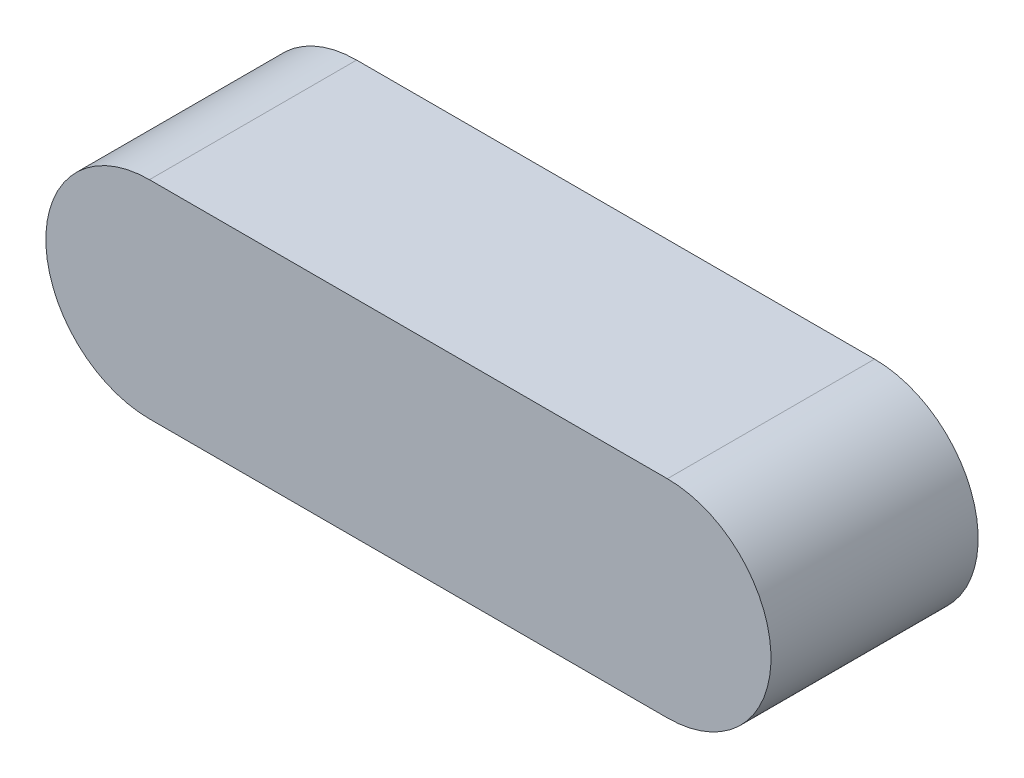
ISO-10303-21;
HEADER;
FILE_DESCRIPTION(('STEP AP214'),'2;1');
FILE_NAME('part.step','',(''),(''),'','','');
FILE_SCHEMA(('AUTOMOTIVE_DESIGN { 1 0 10303 214 1 1 1 1 }'));
ENDSEC;
DATA;
#1=APPLICATION_CONTEXT('core data for automotive mechanical design processes');
#2=APPLICATION_PROTOCOL_DEFINITION('international standard','automotive_design',2000,#1);
#3=PRODUCT_CONTEXT('',#1,'mechanical');
#4=PRODUCT('Part','Part','',(#3));
#5=PRODUCT_RELATED_PRODUCT_CATEGORY('part','',(#4));
#6=PRODUCT_DEFINITION_FORMATION('','',#4);
#7=PRODUCT_DEFINITION_CONTEXT('part definition',#1,'design');
#8=PRODUCT_DEFINITION('design','',#6,#7);
#9=PRODUCT_DEFINITION_SHAPE('','',#8);
#10=(LENGTH_UNIT() NAMED_UNIT(*) SI_UNIT(.MILLI.,.METRE.));
#11=(NAMED_UNIT(*) PLANE_ANGLE_UNIT() SI_UNIT($,.RADIAN.));
#12=(NAMED_UNIT(*) SI_UNIT($,.STERADIAN.) SOLID_ANGLE_UNIT());
#13=UNCERTAINTY_MEASURE_WITH_UNIT(LENGTH_MEASURE(1.E-05),#10,'distance_accuracy_value','');
#14=(GEOMETRIC_REPRESENTATION_CONTEXT(3) GLOBAL_UNCERTAINTY_ASSIGNED_CONTEXT((#13)) GLOBAL_UNIT_ASSIGNED_CONTEXT((#10,
#11,#12)) REPRESENTATION_CONTEXT('',''));
#15=CARTESIAN_POINT('',(0.,0.,0.));
#16=DIRECTION('',(0.,0.,1.));
#17=DIRECTION('',(1.,0.,0.));
#18=AXIS2_PLACEMENT_3D('',#15,#16,#17);
#19=CARTESIAN_POINT('',(0.,0.,4.));
#20=DIRECTION('',(0.,0.,-1.));
#21=DIRECTION('',(-1.,0.,0.));
#22=AXIS2_PLACEMENT_3D('',#19,#20,#21);
#23=CYLINDRICAL_SURFACE('',#22,2.);
#24=CARTESIAN_POINT('',(0.,0.,0.));
#25=DIRECTION('',(0.,0.,1.));
#26=DIRECTION('',(1.,0.,0.));
#27=AXIS2_PLACEMENT_3D('',#24,#25,#26);
#28=CIRCLE('',#27,2.);
#29=CARTESIAN_POINT('',(0.,2.,0.));
#30=VERTEX_POINT('',#29);
#31=CARTESIAN_POINT('',(0.,-2.,0.));
#32=VERTEX_POINT('',#31);
#33=EDGE_CURVE('E96',#30,#32,#28,.T.);
#34=ORIENTED_EDGE('',*,*,#33,.T.);
#35=DIRECTION('',(0.,0.,-1.));
#36=VECTOR('',#35,1.);
#37=CARTESIAN_POINT('',(0.,-2.,4.));
#38=LINE('',#37,#36);
#39=CARTESIAN_POINT('',(0.,-2.,4.));
#40=VERTEX_POINT('',#39);
#41=EDGE_CURVE('E11',#40,#32,#38,.T.);
#42=ORIENTED_EDGE('',*,*,#41,.F.);
#43=CARTESIAN_POINT('',(0.,0.,4.));
#44=DIRECTION('',(0.,0.,1.));
#45=DIRECTION('',(1.,0.,0.));
#46=AXIS2_PLACEMENT_3D('',#43,#44,#45);
#47=CIRCLE('',#46,2.);
#48=CARTESIAN_POINT('',(0.,2.,4.));
#49=VERTEX_POINT('',#48);
#50=EDGE_CURVE('E84',#49,#40,#47,.T.);
#51=ORIENTED_EDGE('',*,*,#50,.F.);
#52=DIRECTION('',(0.,0.,-1.));
#53=VECTOR('',#52,1.);
#54=CARTESIAN_POINT('',(0.,2.,4.));
#55=LINE('',#54,#53);
#56=EDGE_CURVE('E92',#49,#30,#55,.T.);
#57=ORIENTED_EDGE('',*,*,#56,.T.);
#58=EDGE_LOOP('',(#34,#42,#51,#57));
#59=FACE_BOUND('',#58,.T.);
#60=ADVANCED_FACE('F33',(#59),#23,.T.);
#61=CARTESIAN_POINT('',(0.,-2.,4.));
#62=DIRECTION('',(0.,1.,0.));
#63=DIRECTION('',(0.,0.,1.));
#64=AXIS2_PLACEMENT_3D('',#61,#62,#63);
#65=PLANE('',#64);
#66=DIRECTION('',(1.,0.,0.));
#67=VECTOR('',#66,1.);
#68=CARTESIAN_POINT('',(0.,-2.,0.));
#69=LINE('',#68,#67);
#70=CARTESIAN_POINT('',(10.,-2.,0.));
#71=VERTEX_POINT('',#70);
#72=EDGE_CURVE('E88',#32,#71,#69,.T.);
#73=ORIENTED_EDGE('',*,*,#72,.T.);
#74=DIRECTION('',(0.,0.,-1.));
#75=VECTOR('',#74,1.);
#76=CARTESIAN_POINT('',(10.,-2.,4.));
#77=LINE('',#76,#75);
#78=CARTESIAN_POINT('',(10.,-2.,4.));
#79=VERTEX_POINT('',#78);
#80=EDGE_CURVE('E41',#79,#71,#77,.T.);
#81=ORIENTED_EDGE('',*,*,#80,.F.);
#82=DIRECTION('',(1.,0.,0.));
#83=VECTOR('',#82,1.);
#84=CARTESIAN_POINT('',(0.,-2.,4.));
#85=LINE('',#84,#83);
#86=EDGE_CURVE('E79',#40,#79,#85,.T.);
#87=ORIENTED_EDGE('',*,*,#86,.F.);
#88=ORIENTED_EDGE('',*,*,#41,.T.);
#89=EDGE_LOOP('',(#73,#81,#87,#88));
#90=FACE_BOUND('',#89,.T.);
#91=ADVANCED_FACE('F87',(#90),#65,.F.);
#92=CARTESIAN_POINT('',(10.,0.,4.));
#93=DIRECTION('',(0.,0.,-1.));
#94=DIRECTION('',(-1.,0.,0.));
#95=AXIS2_PLACEMENT_3D('',#92,#93,#94);
#96=CYLINDRICAL_SURFACE('',#95,2.);
#97=CARTESIAN_POINT('',(10.,0.,0.));
#98=DIRECTION('',(0.,0.,1.));
#99=DIRECTION('',(1.,0.,0.));
#100=AXIS2_PLACEMENT_3D('',#97,#98,#99);
#101=CIRCLE('',#100,2.);
#102=CARTESIAN_POINT('',(10.,2.,0.));
#103=VERTEX_POINT('',#102);
#104=EDGE_CURVE('E66',#71,#103,#101,.T.);
#105=ORIENTED_EDGE('',*,*,#104,.T.);
#106=DIRECTION('',(0.,0.,-1.));
#107=VECTOR('',#106,1.);
#108=CARTESIAN_POINT('',(10.,2.,4.));
#109=LINE('',#108,#107);
#110=CARTESIAN_POINT('',(10.,2.,4.));
#111=VERTEX_POINT('',#110);
#112=EDGE_CURVE('E89',#111,#103,#109,.T.);
#113=ORIENTED_EDGE('',*,*,#112,.F.);
#114=CARTESIAN_POINT('',(10.,0.,4.));
#115=DIRECTION('',(0.,0.,1.));
#116=DIRECTION('',(1.,0.,0.));
#117=AXIS2_PLACEMENT_3D('',#114,#115,#116);
#118=CIRCLE('',#117,2.);
#119=EDGE_CURVE('E82',#79,#111,#118,.T.);
#120=ORIENTED_EDGE('',*,*,#119,.F.);
#121=ORIENTED_EDGE('',*,*,#80,.T.);
#122=EDGE_LOOP('',(#105,#113,#120,#121));
#123=FACE_BOUND('',#122,.T.);
#124=ADVANCED_FACE('F90',(#123),#96,.T.);
#125=CARTESIAN_POINT('',(0.,2.,4.));
#126=DIRECTION('',(0.,-1.,0.));
#127=DIRECTION('',(0.,0.,-1.));
#128=AXIS2_PLACEMENT_3D('',#125,#126,#127);
#129=PLANE('',#128);
#130=DIRECTION('',(-1.,0.,0.));
#131=VECTOR('',#130,1.);
#132=CARTESIAN_POINT('',(0.,2.,0.));
#133=LINE('',#132,#131);
#134=EDGE_CURVE('E72',#103,#30,#133,.T.);
#135=ORIENTED_EDGE('',*,*,#134,.T.);
#136=ORIENTED_EDGE('',*,*,#56,.F.);
#137=DIRECTION('',(-1.,0.,0.));
#138=VECTOR('',#137,1.);
#139=CARTESIAN_POINT('',(0.,2.,4.));
#140=LINE('',#139,#138);
#141=EDGE_CURVE('E49',#111,#49,#140,.T.);
#142=ORIENTED_EDGE('',*,*,#141,.F.);
#143=ORIENTED_EDGE('',*,*,#112,.T.);
#144=EDGE_LOOP('',(#135,#136,#142,#143));
#145=FACE_BOUND('',#144,.T.);
#146=ADVANCED_FACE('F103',(#145),#129,.F.);
#147=CARTESIAN_POINT('',(0.,0.,4.));
#148=DIRECTION('',(0.,0.,1.));
#149=DIRECTION('',(1.,0.,0.));
#150=AXIS2_PLACEMENT_3D('',#147,#148,#149);
#151=PLANE('',#150);
#152=ORIENTED_EDGE('',*,*,#50,.T.);
#153=ORIENTED_EDGE('',*,*,#86,.T.);
#154=ORIENTED_EDGE('',*,*,#119,.T.);
#155=ORIENTED_EDGE('',*,*,#141,.T.);
#156=EDGE_LOOP('',(#152,#153,#154,#155));
#157=FACE_BOUND('',#156,.T.);
#158=ADVANCED_FACE('F80',(#157),#151,.T.);
#159=CARTESIAN_POINT('',(0.,0.,0.));
#160=DIRECTION('',(0.,0.,1.));
#161=DIRECTION('',(1.,0.,0.));
#162=AXIS2_PLACEMENT_3D('',#159,#160,#161);
#163=PLANE('',#162);
#164=ORIENTED_EDGE('',*,*,#33,.F.);
#165=ORIENTED_EDGE('',*,*,#134,.F.);
#166=ORIENTED_EDGE('',*,*,#104,.F.);
#167=ORIENTED_EDGE('',*,*,#72,.F.);
#168=EDGE_LOOP('',(#164,#165,#166,#167));
#169=FACE_BOUND('',#168,.T.);
#170=ADVANCED_FACE('F106',(#169),#163,.F.);
#171=CLOSED_SHELL('',(#60,#91,#124,#146,#158,#170));
#172=MANIFOLD_SOLID_BREP('B2',#171);
#173=ADVANCED_BREP_SHAPE_REPRESENTATION('',(#18,#172),#14);
#174=SHAPE_DEFINITION_REPRESENTATION(#9,#173);
ENDSEC;
END-ISO-10303-21;
